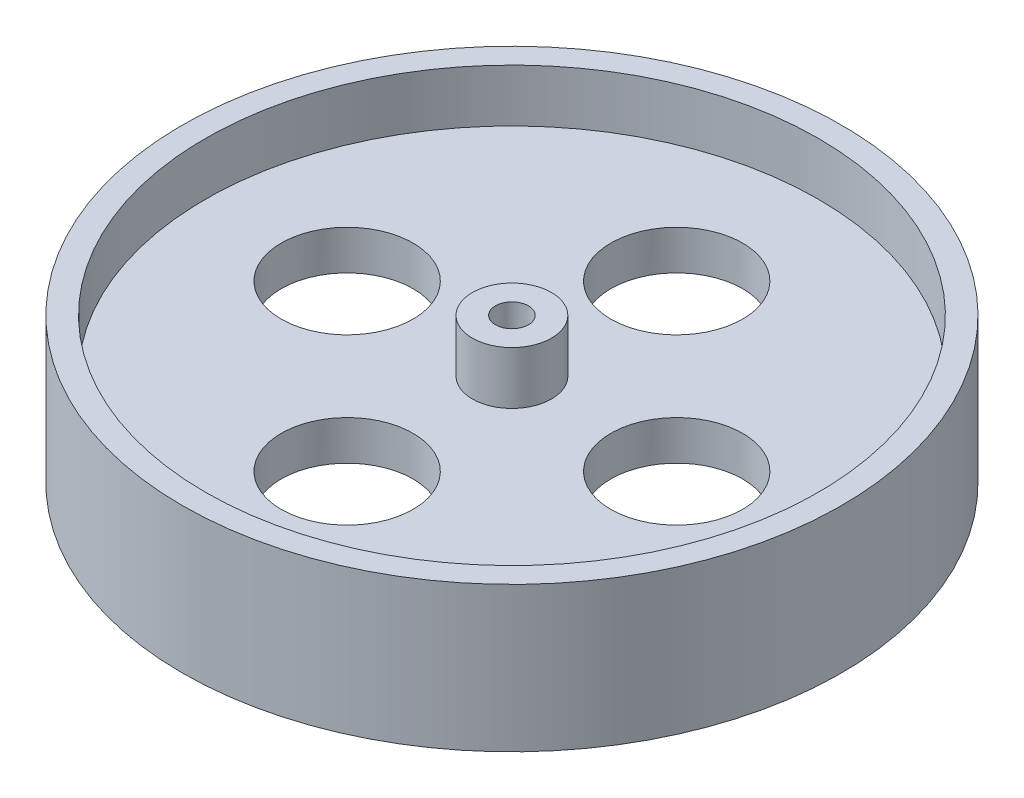
ISO-10303-21;
HEADER;
FILE_DESCRIPTION(('STEP AP214'),'2;1');
FILE_NAME('part.step','',(''),(''),'','','');
FILE_SCHEMA(('AUTOMOTIVE_DESIGN { 1 0 10303 214 1 1 1 1 }'));
ENDSEC;
DATA;
#1=APPLICATION_CONTEXT('core data for automotive mechanical design processes');
#2=APPLICATION_PROTOCOL_DEFINITION('international standard','automotive_design',2000,#1);
#3=PRODUCT_CONTEXT('',#1,'mechanical');
#4=PRODUCT('Part','Part','',(#3));
#5=PRODUCT_RELATED_PRODUCT_CATEGORY('part','',(#4));
#6=PRODUCT_DEFINITION_FORMATION('','',#4);
#7=PRODUCT_DEFINITION_CONTEXT('part definition',#1,'design');
#8=PRODUCT_DEFINITION('design','',#6,#7);
#9=PRODUCT_DEFINITION_SHAPE('','',#8);
#10=(LENGTH_UNIT() NAMED_UNIT(*) SI_UNIT(.MILLI.,.METRE.));
#11=(NAMED_UNIT(*) PLANE_ANGLE_UNIT() SI_UNIT($,.RADIAN.));
#12=(NAMED_UNIT(*) SI_UNIT($,.STERADIAN.) SOLID_ANGLE_UNIT());
#13=UNCERTAINTY_MEASURE_WITH_UNIT(LENGTH_MEASURE(1.E-05),#10,'distance_accuracy_value','');
#14=(GEOMETRIC_REPRESENTATION_CONTEXT(3) GLOBAL_UNCERTAINTY_ASSIGNED_CONTEXT((#13)) GLOBAL_UNIT_ASSIGNED_CONTEXT((#10,
#11,#12)) REPRESENTATION_CONTEXT('',''));
#15=CARTESIAN_POINT('',(0.,0.,0.));
#16=DIRECTION('',(0.,0.,1.));
#17=DIRECTION('',(1.,0.,0.));
#18=AXIS2_PLACEMENT_3D('',#15,#16,#17);
#19=CARTESIAN_POINT('',(0.,0.,0.));
#20=DIRECTION('',(0.,1.,0.));
#21=DIRECTION('',(0.,0.,1.));
#22=AXIS2_PLACEMENT_3D('',#19,#20,#21);
#23=PLANE('',#22);
#24=CARTESIAN_POINT('',(0.,0.,0.));
#25=DIRECTION('',(0.,-1.,0.));
#26=DIRECTION('',(0.,0.,-1.));
#27=AXIS2_PLACEMENT_3D('',#24,#25,#26);
#28=CIRCLE('',#27,2.5);
#29=CARTESIAN_POINT('',(-2.41569999779732,0.,-0.64373404496115));
#30=VERTEX_POINT('',#29);
#31=CARTESIAN_POINT('',(-2.17032892400685,0.,1.24083534831148));
#32=VERTEX_POINT('',#31);
#33=EDGE_CURVE('E70',#30,#32,#28,.T.);
#34=ORIENTED_EDGE('',*,*,#33,.F.);
#35=DIRECTION('',(-0.129110329612429,0.,-0.991630234909853));
#36=VECTOR('',#35,1.);
#37=CARTESIAN_POINT('',(-2.29301446090208,0.,0.298550651675165));
#38=LINE('',#37,#36);
#39=EDGE_CURVE('E55',#32,#30,#38,.T.);
#40=ORIENTED_EDGE('',*,*,#39,.F.);
#41=EDGE_LOOP('',(#34,#40));
#42=FACE_BOUND('',#41,.T.);
#43=CARTESIAN_POINT('',(0.,0.,0.));
#44=DIRECTION('',(0.,-1.,0.));
#45=DIRECTION('',(0.,0.,-1.));
#46=AXIS2_PLACEMENT_3D('',#43,#44,#45);
#47=CIRCLE('',#46,6.);
#48=CARTESIAN_POINT('',(0.,0.,-6.));
#49=VERTEX_POINT('',#48);
#50=EDGE_CURVE('E94',#49,#49,#47,.T.);
#51=ORIENTED_EDGE('',*,*,#50,.T.);
#52=EDGE_LOOP('',(#51));
#53=FACE_BOUND('',#52,.T.);
#54=ADVANCED_FACE('F33',(#42,#53),#23,.F.);
#55=CARTESIAN_POINT('',(0.,22.,0.));
#56=DIRECTION('',(0.,1.,0.));
#57=DIRECTION('',(0.,0.,1.));
#58=AXIS2_PLACEMENT_3D('',#55,#56,#57);
#59=PLANE('',#58);
#60=CARTESIAN_POINT('',(0.,22.,0.));
#61=DIRECTION('',(0.,1.,0.));
#62=DIRECTION('',(0.,0.,1.));
#63=AXIS2_PLACEMENT_3D('',#60,#61,#62);
#64=CIRCLE('',#63,2.5);
#65=CARTESIAN_POINT('',(0.,22.,2.5));
#66=VERTEX_POINT('',#65);
#67=EDGE_CURVE('E67',#66,#66,#64,.T.);
#68=ORIENTED_EDGE('',*,*,#67,.F.);
#69=EDGE_LOOP('',(#68));
#70=FACE_BOUND('',#69,.T.);
#71=CARTESIAN_POINT('',(0.,22.,0.));
#72=DIRECTION('',(0.,1.,0.));
#73=DIRECTION('',(0.,0.,1.));
#74=AXIS2_PLACEMENT_3D('',#71,#72,#73);
#75=CIRCLE('',#74,6.);
#76=CARTESIAN_POINT('',(0.,22.,6.));
#77=VERTEX_POINT('',#76);
#78=EDGE_CURVE('E125',#77,#77,#75,.T.);
#79=ORIENTED_EDGE('',*,*,#78,.T.);
#80=EDGE_LOOP('',(#79));
#81=FACE_BOUND('',#80,.T.);
#82=ADVANCED_FACE('F142',(#70,#81),#59,.T.);
#83=CARTESIAN_POINT('',(0.,15.,0.));
#84=DIRECTION('',(0.,1.,0.));
#85=DIRECTION('',(0.,0.,1.));
#86=AXIS2_PLACEMENT_3D('',#83,#84,#85);
#87=PLANE('',#86);
#88=CARTESIAN_POINT('',(0.,15.,0.));
#89=DIRECTION('',(0.,1.,0.));
#90=DIRECTION('',(0.,0.,1.));
#91=AXIS2_PLACEMENT_3D('',#88,#89,#90);
#92=CIRCLE('',#91,2.5);
#93=CARTESIAN_POINT('',(-2.41569999779732,15.,-0.643734044961148));
#94=VERTEX_POINT('',#93);
#95=CARTESIAN_POINT('',(-2.17032892400685,15.,1.24083534831148));
#96=VERTEX_POINT('',#95);
#97=EDGE_CURVE('E85',#94,#96,#92,.T.);
#98=ORIENTED_EDGE('',*,*,#97,.T.);
#99=DIRECTION('',(-0.129110329612429,0.,-0.991630234909853));
#100=VECTOR('',#99,1.);
#101=CARTESIAN_POINT('',(-2.29301446090208,15.,0.298550651675165));
#102=LINE('',#101,#100);
#103=EDGE_CURVE('E63',#96,#94,#102,.T.);
#104=ORIENTED_EDGE('',*,*,#103,.T.);
#105=EDGE_LOOP('',(#98,#104));
#106=FACE_BOUND('',#105,.T.);
#107=ADVANCED_FACE('F147',(#106),#87,.T.);
#108=CARTESIAN_POINT('',(0.,22.,0.));
#109=DIRECTION('',(0.,-1.,0.));
#110=DIRECTION('',(0.,0.,-1.));
#111=AXIS2_PLACEMENT_3D('',#108,#109,#110);
#112=CYLINDRICAL_SURFACE('',#111,50.);
#113=CARTESIAN_POINT('',(0.,22.,0.));
#114=DIRECTION('',(0.,1.,0.));
#115=DIRECTION('',(0.,0.,1.));
#116=AXIS2_PLACEMENT_3D('',#113,#114,#115);
#117=CIRCLE('',#116,50.);
#118=CARTESIAN_POINT('',(0.,22.,50.));
#119=VERTEX_POINT('',#118);
#120=EDGE_CURVE('E11',#119,#119,#117,.T.);
#121=ORIENTED_EDGE('',*,*,#120,.F.);
#122=EDGE_LOOP('',(#121));
#123=FACE_BOUND('',#122,.T.);
#124=CARTESIAN_POINT('',(0.,0.,0.));
#125=DIRECTION('',(0.,1.,0.));
#126=DIRECTION('',(0.,0.,1.));
#127=AXIS2_PLACEMENT_3D('',#124,#125,#126);
#128=CIRCLE('',#127,50.);
#129=CARTESIAN_POINT('',(0.,0.,50.));
#130=VERTEX_POINT('',#129);
#131=EDGE_CURVE('E42',#130,#130,#128,.T.);
#132=ORIENTED_EDGE('',*,*,#131,.T.);
#133=EDGE_LOOP('',(#132));
#134=FACE_BOUND('',#133,.T.);
#135=ADVANCED_FACE('F35',(#123,#134),#112,.T.);
#136=CARTESIAN_POINT('',(0.,22.,0.));
#137=DIRECTION('',(0.,1.,0.));
#138=DIRECTION('',(0.,0.,1.));
#139=AXIS2_PLACEMENT_3D('',#136,#137,#138);
#140=CIRCLE('',#139,46.5);
#141=CARTESIAN_POINT('',(0.,22.,46.5));
#142=VERTEX_POINT('',#141);
#143=EDGE_CURVE('E79',#142,#142,#140,.T.);
#144=ORIENTED_EDGE('',*,*,#143,.F.);
#145=EDGE_LOOP('',(#144));
#146=FACE_BOUND('',#145,.T.);
#147=ORIENTED_EDGE('',*,*,#120,.T.);
#148=EDGE_LOOP('',(#147));
#149=FACE_BOUND('',#148,.T.);
#150=ADVANCED_FACE('F137',(#146,#149),#59,.T.);
#151=CARTESIAN_POINT('',(0.,0.,0.));
#152=DIRECTION('',(0.,-1.,0.));
#153=DIRECTION('',(0.,0.,-1.));
#154=AXIS2_PLACEMENT_3D('',#151,#152,#153);
#155=CIRCLE('',#154,46.5);
#156=CARTESIAN_POINT('',(0.,0.,-46.5));
#157=VERTEX_POINT('',#156);
#158=EDGE_CURVE('E119',#157,#157,#155,.T.);
#159=ORIENTED_EDGE('',*,*,#158,.F.);
#160=EDGE_LOOP('',(#159));
#161=FACE_BOUND('',#160,.T.);
#162=ORIENTED_EDGE('',*,*,#131,.F.);
#163=EDGE_LOOP('',(#162));
#164=FACE_BOUND('',#163,.T.);
#165=ADVANCED_FACE('F140',(#161,#164),#23,.F.);
#166=CARTESIAN_POINT('',(0.,15.,0.));
#167=DIRECTION('',(0.,1.,0.));
#168=DIRECTION('',(0.,0.,1.));
#169=AXIS2_PLACEMENT_3D('',#166,#167,#168);
#170=CYLINDRICAL_SURFACE('',#169,2.5);
#171=ORIENTED_EDGE('',*,*,#97,.F.);
#172=DIRECTION('',(0.,-1.,0.));
#173=VECTOR('',#172,1.);
#174=CARTESIAN_POINT('',(-2.41569999779732,15.,-0.64373404496115));
#175=LINE('',#174,#173);
#176=EDGE_CURVE('E50',#94,#30,#175,.T.);
#177=ORIENTED_EDGE('',*,*,#176,.T.);
#178=ORIENTED_EDGE('',*,*,#33,.T.);
#179=DIRECTION('',(0.,-1.,0.));
#180=VECTOR('',#179,1.);
#181=CARTESIAN_POINT('',(-2.17032892400685,15.,1.24083534831148));
#182=LINE('',#181,#180);
#183=EDGE_CURVE('E60',#96,#32,#182,.T.);
#184=ORIENTED_EDGE('',*,*,#183,.F.);
#185=EDGE_LOOP('',(#171,#177,#178,#184));
#186=FACE_BOUND('',#185,.T.);
#187=ORIENTED_EDGE('',*,*,#67,.T.);
#188=EDGE_LOOP('',(#187));
#189=FACE_BOUND('',#188,.T.);
#190=ADVANCED_FACE('F71',(#186,#189),#170,.F.);
#191=CARTESIAN_POINT('',(-2.29301446090208,15.,0.298550651675165));
#192=DIRECTION('',(-0.991630234909853,0.,0.129110329612429));
#193=DIRECTION('',(0.129110329612429,0.,0.991630234909853));
#194=AXIS2_PLACEMENT_3D('',#191,#192,#193);
#195=PLANE('',#194);
#196=ORIENTED_EDGE('',*,*,#39,.T.);
#197=ORIENTED_EDGE('',*,*,#176,.F.);
#198=ORIENTED_EDGE('',*,*,#103,.F.);
#199=ORIENTED_EDGE('',*,*,#183,.T.);
#200=EDGE_LOOP('',(#196,#197,#198,#199));
#201=FACE_BOUND('',#200,.T.);
#202=ADVANCED_FACE('F62',(#201),#195,.F.);
#203=CARTESIAN_POINT('',(0.,14.,0.));
#204=DIRECTION('',(0.,1.,0.));
#205=DIRECTION('',(0.,0.,1.));
#206=AXIS2_PLACEMENT_3D('',#203,#204,#205);
#207=CYLINDRICAL_SURFACE('',#206,46.5);
#208=CARTESIAN_POINT('',(0.,14.,0.));
#209=DIRECTION('',(0.,1.,0.));
#210=DIRECTION('',(0.,0.,1.));
#211=AXIS2_PLACEMENT_3D('',#208,#209,#210);
#212=CIRCLE('',#211,46.5);
#213=CARTESIAN_POINT('',(0.,14.,46.5));
#214=VERTEX_POINT('',#213);
#215=EDGE_CURVE('E76',#214,#214,#212,.T.);
#216=ORIENTED_EDGE('',*,*,#215,.F.);
#217=EDGE_LOOP('',(#216));
#218=FACE_BOUND('',#217,.T.);
#219=ORIENTED_EDGE('',*,*,#143,.T.);
#220=EDGE_LOOP('',(#219));
#221=FACE_BOUND('',#220,.T.);
#222=ADVANCED_FACE('F135',(#218,#221),#207,.F.);
#223=CARTESIAN_POINT('',(0.,14.,0.));
#224=DIRECTION('',(0.,1.,0.));
#225=DIRECTION('',(0.,0.,1.));
#226=AXIS2_PLACEMENT_3D('',#223,#224,#225);
#227=PLANE('',#226);
#228=CARTESIAN_POINT('',(-25.,14.,0.));
#229=DIRECTION('',(0.,1.,0.));
#230=DIRECTION('',(0.,0.,1.));
#231=AXIS2_PLACEMENT_3D('',#228,#229,#230);
#232=CIRCLE('',#231,10.);
#233=CARTESIAN_POINT('',(-25.,14.,10.));
#234=VERTEX_POINT('',#233);
#235=EDGE_CURVE('E111',#234,#234,#232,.T.);
#236=ORIENTED_EDGE('',*,*,#235,.F.);
#237=EDGE_LOOP('',(#236));
#238=FACE_BOUND('',#237,.T.);
#239=CARTESIAN_POINT('',(0.,14.,25.));
#240=DIRECTION('',(0.,1.,0.));
#241=DIRECTION('',(0.,0.,1.));
#242=AXIS2_PLACEMENT_3D('',#239,#240,#241);
#243=CIRCLE('',#242,10.);
#244=CARTESIAN_POINT('',(0.,14.,35.));
#245=VERTEX_POINT('',#244);
#246=EDGE_CURVE('E101',#245,#245,#243,.T.);
#247=ORIENTED_EDGE('',*,*,#246,.F.);
#248=EDGE_LOOP('',(#247));
#249=FACE_BOUND('',#248,.T.);
#250=CARTESIAN_POINT('',(25.,14.,0.));
#251=DIRECTION('',(0.,1.,0.));
#252=DIRECTION('',(0.,0.,1.));
#253=AXIS2_PLACEMENT_3D('',#250,#251,#252);
#254=CIRCLE('',#253,10.);
#255=CARTESIAN_POINT('',(25.,14.,10.));
#256=VERTEX_POINT('',#255);
#257=EDGE_CURVE('E98',#256,#256,#254,.T.);
#258=ORIENTED_EDGE('',*,*,#257,.F.);
#259=EDGE_LOOP('',(#258));
#260=FACE_BOUND('',#259,.T.);
#261=CARTESIAN_POINT('',(0.,14.,-25.));
#262=DIRECTION('',(0.,1.,0.));
#263=DIRECTION('',(0.,0.,1.));
#264=AXIS2_PLACEMENT_3D('',#261,#262,#263);
#265=CIRCLE('',#264,10.);
#266=CARTESIAN_POINT('',(0.,14.,-15.));
#267=VERTEX_POINT('',#266);
#268=EDGE_CURVE('E95',#267,#267,#265,.T.);
#269=ORIENTED_EDGE('',*,*,#268,.F.);
#270=EDGE_LOOP('',(#269));
#271=FACE_BOUND('',#270,.T.);
#272=CARTESIAN_POINT('',(0.,14.,0.));
#273=DIRECTION('',(0.,1.,0.));
#274=DIRECTION('',(0.,0.,1.));
#275=AXIS2_PLACEMENT_3D('',#272,#273,#274);
#276=CIRCLE('',#275,6.);
#277=CARTESIAN_POINT('',(0.,14.,6.));
#278=VERTEX_POINT('',#277);
#279=EDGE_CURVE('E128',#278,#278,#276,.T.);
#280=ORIENTED_EDGE('',*,*,#279,.F.);
#281=EDGE_LOOP('',(#280));
#282=FACE_BOUND('',#281,.T.);
#283=ORIENTED_EDGE('',*,*,#215,.T.);
#284=EDGE_LOOP('',(#283));
#285=FACE_BOUND('',#284,.T.);
#286=ADVANCED_FACE('F174',(#238,#249,#260,#271,#282,#285),#227,.T.);
#287=CARTESIAN_POINT('',(0.,14.,0.));
#288=DIRECTION('',(0.,1.,0.));
#289=DIRECTION('',(0.,0.,1.));
#290=AXIS2_PLACEMENT_3D('',#287,#288,#289);
#291=CYLINDRICAL_SURFACE('',#290,6.);
#292=ORIENTED_EDGE('',*,*,#279,.T.);
#293=EDGE_LOOP('',(#292));
#294=FACE_BOUND('',#293,.T.);
#295=ORIENTED_EDGE('',*,*,#78,.F.);
#296=EDGE_LOOP('',(#295));
#297=FACE_BOUND('',#296,.T.);
#298=ADVANCED_FACE('F178',(#294,#297),#291,.T.);
#299=CARTESIAN_POINT('',(0.,8.,0.));
#300=DIRECTION('',(0.,-1.,0.));
#301=DIRECTION('',(0.,0.,-1.));
#302=AXIS2_PLACEMENT_3D('',#299,#300,#301);
#303=CYLINDRICAL_SURFACE('',#302,46.5);
#304=CARTESIAN_POINT('',(0.,8.,0.));
#305=DIRECTION('',(0.,-1.,0.));
#306=DIRECTION('',(0.,0.,-1.));
#307=AXIS2_PLACEMENT_3D('',#304,#305,#306);
#308=CIRCLE('',#307,46.5);
#309=CARTESIAN_POINT('',(0.,8.,-46.5));
#310=VERTEX_POINT('',#309);
#311=EDGE_CURVE('E122',#310,#310,#308,.T.);
#312=ORIENTED_EDGE('',*,*,#311,.F.);
#313=EDGE_LOOP('',(#312));
#314=FACE_BOUND('',#313,.T.);
#315=ORIENTED_EDGE('',*,*,#158,.T.);
#316=EDGE_LOOP('',(#315));
#317=FACE_BOUND('',#316,.T.);
#318=ADVANCED_FACE('F182',(#314,#317),#303,.F.);
#319=CARTESIAN_POINT('',(0.,8.,0.));
#320=DIRECTION('',(0.,-1.,0.));
#321=DIRECTION('',(0.,0.,-1.));
#322=AXIS2_PLACEMENT_3D('',#319,#320,#321);
#323=PLANE('',#322);
#324=CARTESIAN_POINT('',(-25.,8.,0.));
#325=DIRECTION('',(0.,-1.,0.));
#326=DIRECTION('',(0.,0.,-1.));
#327=AXIS2_PLACEMENT_3D('',#324,#325,#326);
#328=CIRCLE('',#327,10.);
#329=CARTESIAN_POINT('',(-25.,8.,-10.));
#330=VERTEX_POINT('',#329);
#331=EDGE_CURVE('E37',#330,#330,#328,.T.);
#332=ORIENTED_EDGE('',*,*,#331,.F.);
#333=EDGE_LOOP('',(#332));
#334=FACE_BOUND('',#333,.T.);
#335=CARTESIAN_POINT('',(0.,8.,25.));
#336=DIRECTION('',(0.,-1.,0.));
#337=DIRECTION('',(0.,0.,-1.));
#338=AXIS2_PLACEMENT_3D('',#335,#336,#337);
#339=CIRCLE('',#338,10.);
#340=CARTESIAN_POINT('',(0.,8.,15.));
#341=VERTEX_POINT('',#340);
#342=EDGE_CURVE('E99',#341,#341,#339,.T.);
#343=ORIENTED_EDGE('',*,*,#342,.F.);
#344=EDGE_LOOP('',(#343));
#345=FACE_BOUND('',#344,.T.);
#346=CARTESIAN_POINT('',(25.,8.,0.));
#347=DIRECTION('',(0.,-1.,0.));
#348=DIRECTION('',(0.,0.,-1.));
#349=AXIS2_PLACEMENT_3D('',#346,#347,#348);
#350=CIRCLE('',#349,10.);
#351=CARTESIAN_POINT('',(25.,8.,-10.));
#352=VERTEX_POINT('',#351);
#353=EDGE_CURVE('E96',#352,#352,#350,.T.);
#354=ORIENTED_EDGE('',*,*,#353,.F.);
#355=EDGE_LOOP('',(#354));
#356=FACE_BOUND('',#355,.T.);
#357=CARTESIAN_POINT('',(0.,8.,-25.));
#358=DIRECTION('',(0.,-1.,0.));
#359=DIRECTION('',(0.,0.,-1.));
#360=AXIS2_PLACEMENT_3D('',#357,#358,#359);
#361=CIRCLE('',#360,10.);
#362=CARTESIAN_POINT('',(0.,8.,-35.));
#363=VERTEX_POINT('',#362);
#364=EDGE_CURVE('E91',#363,#363,#361,.T.);
#365=ORIENTED_EDGE('',*,*,#364,.F.);
#366=EDGE_LOOP('',(#365));
#367=FACE_BOUND('',#366,.T.);
#368=CARTESIAN_POINT('',(0.,8.,0.));
#369=DIRECTION('',(0.,-1.,0.));
#370=DIRECTION('',(0.,0.,-1.));
#371=AXIS2_PLACEMENT_3D('',#368,#369,#370);
#372=CIRCLE('',#371,6.);
#373=CARTESIAN_POINT('',(0.,8.,-6.));
#374=VERTEX_POINT('',#373);
#375=EDGE_CURVE('E116',#374,#374,#372,.T.);
#376=ORIENTED_EDGE('',*,*,#375,.F.);
#377=EDGE_LOOP('',(#376));
#378=FACE_BOUND('',#377,.T.);
#379=ORIENTED_EDGE('',*,*,#311,.T.);
#380=EDGE_LOOP('',(#379));
#381=FACE_BOUND('',#380,.T.);
#382=ADVANCED_FACE('F186',(#334,#345,#356,#367,#378,#381),#323,.T.);
#383=CARTESIAN_POINT('',(0.,8.,0.));
#384=DIRECTION('',(0.,-1.,0.));
#385=DIRECTION('',(0.,0.,-1.));
#386=AXIS2_PLACEMENT_3D('',#383,#384,#385);
#387=CYLINDRICAL_SURFACE('',#386,6.);
#388=ORIENTED_EDGE('',*,*,#375,.T.);
#389=EDGE_LOOP('',(#388));
#390=FACE_BOUND('',#389,.T.);
#391=ORIENTED_EDGE('',*,*,#50,.F.);
#392=EDGE_LOOP('',(#391));
#393=FACE_BOUND('',#392,.T.);
#394=ADVANCED_FACE('F190',(#390,#393),#387,.T.);
#395=CARTESIAN_POINT('',(0.,6.,-25.));
#396=DIRECTION('',(0.,1.,0.));
#397=DIRECTION('',(0.,0.,1.));
#398=AXIS2_PLACEMENT_3D('',#395,#396,#397);
#399=CYLINDRICAL_SURFACE('',#398,10.);
#400=ORIENTED_EDGE('',*,*,#364,.T.);
#401=EDGE_LOOP('',(#400));
#402=FACE_BOUND('',#401,.T.);
#403=ORIENTED_EDGE('',*,*,#268,.T.);
#404=EDGE_LOOP('',(#403));
#405=FACE_BOUND('',#404,.T.);
#406=ADVANCED_FACE('F194',(#402,#405),#399,.F.);
#407=CARTESIAN_POINT('',(25.,6.,0.));
#408=DIRECTION('',(0.,1.,0.));
#409=DIRECTION('',(0.,0.,1.));
#410=AXIS2_PLACEMENT_3D('',#407,#408,#409);
#411=CYLINDRICAL_SURFACE('',#410,10.);
#412=ORIENTED_EDGE('',*,*,#353,.T.);
#413=EDGE_LOOP('',(#412));
#414=FACE_BOUND('',#413,.T.);
#415=ORIENTED_EDGE('',*,*,#257,.T.);
#416=EDGE_LOOP('',(#415));
#417=FACE_BOUND('',#416,.T.);
#418=ADVANCED_FACE('F198',(#414,#417),#411,.F.);
#419=CARTESIAN_POINT('',(0.,6.,25.));
#420=DIRECTION('',(0.,1.,0.));
#421=DIRECTION('',(0.,0.,1.));
#422=AXIS2_PLACEMENT_3D('',#419,#420,#421);
#423=CYLINDRICAL_SURFACE('',#422,10.);
#424=ORIENTED_EDGE('',*,*,#342,.T.);
#425=EDGE_LOOP('',(#424));
#426=FACE_BOUND('',#425,.T.);
#427=ORIENTED_EDGE('',*,*,#246,.T.);
#428=EDGE_LOOP('',(#427));
#429=FACE_BOUND('',#428,.T.);
#430=ADVANCED_FACE('F202',(#426,#429),#423,.F.);
#431=CARTESIAN_POINT('',(-25.,6.,0.));
#432=DIRECTION('',(0.,1.,0.));
#433=DIRECTION('',(0.,0.,1.));
#434=AXIS2_PLACEMENT_3D('',#431,#432,#433);
#435=CYLINDRICAL_SURFACE('',#434,10.);
#436=ORIENTED_EDGE('',*,*,#331,.T.);
#437=EDGE_LOOP('',(#436));
#438=FACE_BOUND('',#437,.T.);
#439=ORIENTED_EDGE('',*,*,#235,.T.);
#440=EDGE_LOOP('',(#439));
#441=FACE_BOUND('',#440,.T.);
#442=ADVANCED_FACE('F206',(#438,#441),#435,.F.);
#443=CLOSED_SHELL('',(#54,#82,#107,#135,#150,#165,#190,#202,#222,#286,#298,#318,#382,#394,#406,
#418,#430,#442));
#444=MANIFOLD_SOLID_BREP('B2',#443);
#445=ADVANCED_BREP_SHAPE_REPRESENTATION('',(#18,#444),#14);
#446=SHAPE_DEFINITION_REPRESENTATION(#9,#445);
ENDSEC;
END-ISO-10303-21;
